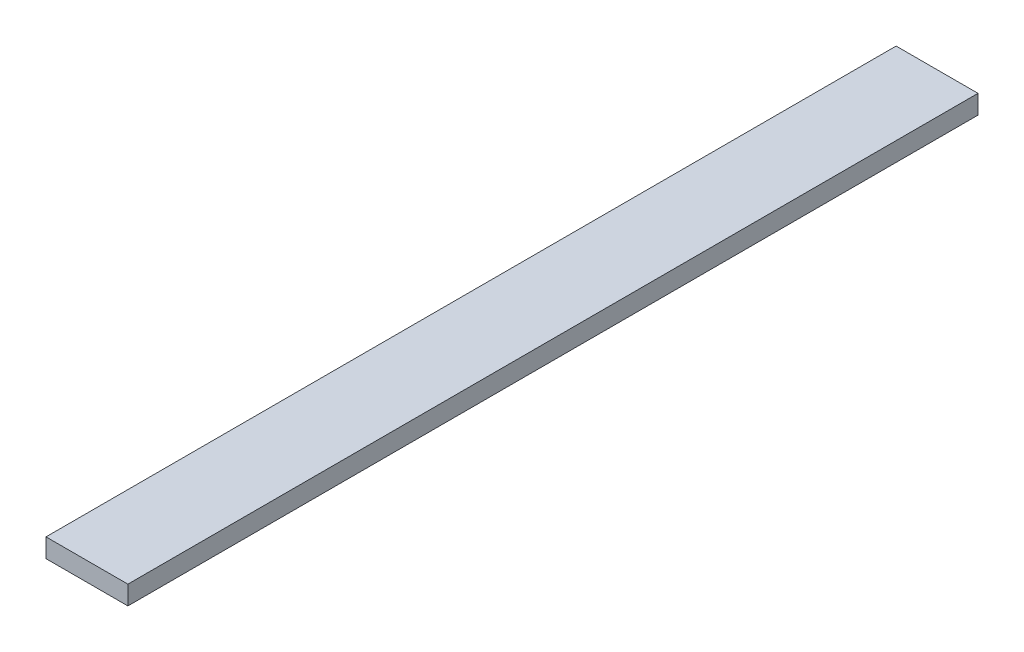
ISO-10303-21;
HEADER;
FILE_DESCRIPTION(('STEP AP214'),'2;1');
FILE_NAME('part.step','',(''),(''),'','','');
FILE_SCHEMA(('AUTOMOTIVE_DESIGN { 1 0 10303 214 1 1 1 1 }'));
ENDSEC;
DATA;
#1=APPLICATION_CONTEXT('core data for automotive mechanical design processes');
#2=APPLICATION_PROTOCOL_DEFINITION('international standard','automotive_design',2000,#1);
#3=PRODUCT_CONTEXT('',#1,'mechanical');
#4=PRODUCT('Part','Part','',(#3));
#5=PRODUCT_RELATED_PRODUCT_CATEGORY('part','',(#4));
#6=PRODUCT_DEFINITION_FORMATION('','',#4);
#7=PRODUCT_DEFINITION_CONTEXT('part definition',#1,'design');
#8=PRODUCT_DEFINITION('design','',#6,#7);
#9=PRODUCT_DEFINITION_SHAPE('','',#8);
#10=(LENGTH_UNIT() NAMED_UNIT(*) SI_UNIT(.MILLI.,.METRE.));
#11=(NAMED_UNIT(*) PLANE_ANGLE_UNIT() SI_UNIT($,.RADIAN.));
#12=(NAMED_UNIT(*) SI_UNIT($,.STERADIAN.) SOLID_ANGLE_UNIT());
#13=UNCERTAINTY_MEASURE_WITH_UNIT(LENGTH_MEASURE(1.E-05),#10,'distance_accuracy_value','');
#14=(GEOMETRIC_REPRESENTATION_CONTEXT(3) GLOBAL_UNCERTAINTY_ASSIGNED_CONTEXT((#13)) GLOBAL_UNIT_ASSIGNED_CONTEXT((#10,
#11,#12)) REPRESENTATION_CONTEXT('',''));
#15=CARTESIAN_POINT('',(0.,0.,0.));
#16=DIRECTION('',(0.,0.,1.));
#17=DIRECTION('',(1.,0.,0.));
#18=AXIS2_PLACEMENT_3D('',#15,#16,#17);
#19=CARTESIAN_POINT('',(0.,0.,428.498));
#20=DIRECTION('',(1.,0.,0.));
#21=DIRECTION('',(0.,0.,-1.));
#22=AXIS2_PLACEMENT_3D('',#19,#20,#21);
#23=PLANE('',#22);
#24=DIRECTION('',(0.,-1.,0.));
#25=VECTOR('',#24,1.);
#26=CARTESIAN_POINT('',(0.,0.,0.));
#27=LINE('',#26,#25);
#28=CARTESIAN_POINT('',(0.,9.525,0.));
#29=VERTEX_POINT('',#28);
#30=CARTESIAN_POINT('',(0.,0.,0.));
#31=VERTEX_POINT('',#30);
#32=EDGE_CURVE('E98',#29,#31,#27,.T.);
#33=ORIENTED_EDGE('',*,*,#32,.T.);
#34=DIRECTION('',(0.,0.,-1.));
#35=VECTOR('',#34,1.);
#36=CARTESIAN_POINT('',(0.,0.,428.498));
#37=LINE('',#36,#35);
#38=CARTESIAN_POINT('',(0.,0.,428.498));
#39=VERTEX_POINT('',#38);
#40=EDGE_CURVE('E11',#39,#31,#37,.T.);
#41=ORIENTED_EDGE('',*,*,#40,.F.);
#42=DIRECTION('',(0.,-1.,0.));
#43=VECTOR('',#42,1.);
#44=CARTESIAN_POINT('',(0.,0.,428.498));
#45=LINE('',#44,#43);
#46=CARTESIAN_POINT('',(0.,9.525,428.498));
#47=VERTEX_POINT('',#46);
#48=EDGE_CURVE('E86',#47,#39,#45,.T.);
#49=ORIENTED_EDGE('',*,*,#48,.F.);
#50=DIRECTION('',(0.,0.,-1.));
#51=VECTOR('',#50,1.);
#52=CARTESIAN_POINT('',(0.,9.525,428.498));
#53=LINE('',#52,#51);
#54=EDGE_CURVE('E94',#47,#29,#53,.T.);
#55=ORIENTED_EDGE('',*,*,#54,.T.);
#56=EDGE_LOOP('',(#33,#41,#49,#55));
#57=FACE_BOUND('',#56,.T.);
#58=ADVANCED_FACE('F35',(#57),#23,.F.);
#59=CARTESIAN_POINT('',(0.,0.,428.498));
#60=DIRECTION('',(0.,1.,0.));
#61=DIRECTION('',(0.,0.,1.));
#62=AXIS2_PLACEMENT_3D('',#59,#60,#61);
#63=PLANE('',#62);
#64=DIRECTION('',(1.,0.,0.));
#65=VECTOR('',#64,1.);
#66=CARTESIAN_POINT('',(0.,0.,0.));
#67=LINE('',#66,#65);
#68=CARTESIAN_POINT('',(41.275,0.,0.));
#69=VERTEX_POINT('',#68);
#70=EDGE_CURVE('E90',#31,#69,#67,.T.);
#71=ORIENTED_EDGE('',*,*,#70,.T.);
#72=DIRECTION('',(0.,0.,-1.));
#73=VECTOR('',#72,1.);
#74=CARTESIAN_POINT('',(41.275,0.,428.498));
#75=LINE('',#74,#73);
#76=CARTESIAN_POINT('',(41.275,0.,428.498));
#77=VERTEX_POINT('',#76);
#78=EDGE_CURVE('E43',#77,#69,#75,.T.);
#79=ORIENTED_EDGE('',*,*,#78,.F.);
#80=DIRECTION('',(1.,0.,0.));
#81=VECTOR('',#80,1.);
#82=CARTESIAN_POINT('',(0.,0.,428.498));
#83=LINE('',#82,#81);
#84=EDGE_CURVE('E81',#39,#77,#83,.T.);
#85=ORIENTED_EDGE('',*,*,#84,.F.);
#86=ORIENTED_EDGE('',*,*,#40,.T.);
#87=EDGE_LOOP('',(#71,#79,#85,#86));
#88=FACE_BOUND('',#87,.T.);
#89=ADVANCED_FACE('F89',(#88),#63,.F.);
#90=CARTESIAN_POINT('',(41.275,0.,428.498));
#91=DIRECTION('',(-1.,0.,0.));
#92=DIRECTION('',(0.,0.,1.));
#93=AXIS2_PLACEMENT_3D('',#90,#91,#92);
#94=PLANE('',#93);
#95=DIRECTION('',(0.,1.,0.));
#96=VECTOR('',#95,1.);
#97=CARTESIAN_POINT('',(41.275,0.,0.));
#98=LINE('',#97,#96);
#99=CARTESIAN_POINT('',(41.275,9.525,0.));
#100=VERTEX_POINT('',#99);
#101=EDGE_CURVE('E68',#69,#100,#98,.T.);
#102=ORIENTED_EDGE('',*,*,#101,.T.);
#103=DIRECTION('',(0.,0.,-1.));
#104=VECTOR('',#103,1.);
#105=CARTESIAN_POINT('',(41.275,9.525,428.498));
#106=LINE('',#105,#104);
#107=CARTESIAN_POINT('',(41.275,9.525,428.498));
#108=VERTEX_POINT('',#107);
#109=EDGE_CURVE('E91',#108,#100,#106,.T.);
#110=ORIENTED_EDGE('',*,*,#109,.F.);
#111=DIRECTION('',(0.,1.,0.));
#112=VECTOR('',#111,1.);
#113=CARTESIAN_POINT('',(41.275,0.,428.498));
#114=LINE('',#113,#112);
#115=EDGE_CURVE('E84',#77,#108,#114,.T.);
#116=ORIENTED_EDGE('',*,*,#115,.F.);
#117=ORIENTED_EDGE('',*,*,#78,.T.);
#118=EDGE_LOOP('',(#102,#110,#116,#117));
#119=FACE_BOUND('',#118,.T.);
#120=ADVANCED_FACE('F92',(#119),#94,.F.);
#121=CARTESIAN_POINT('',(0.,9.525,428.498));
#122=DIRECTION('',(0.,-1.,0.));
#123=DIRECTION('',(0.,0.,-1.));
#124=AXIS2_PLACEMENT_3D('',#121,#122,#123);
#125=PLANE('',#124);
#126=DIRECTION('',(-1.,0.,0.));
#127=VECTOR('',#126,1.);
#128=CARTESIAN_POINT('',(0.,9.525,0.));
#129=LINE('',#128,#127);
#130=EDGE_CURVE('E74',#100,#29,#129,.T.);
#131=ORIENTED_EDGE('',*,*,#130,.T.);
#132=ORIENTED_EDGE('',*,*,#54,.F.);
#133=DIRECTION('',(-1.,0.,0.));
#134=VECTOR('',#133,1.);
#135=CARTESIAN_POINT('',(0.,9.525,428.498));
#136=LINE('',#135,#134);
#137=EDGE_CURVE('E51',#108,#47,#136,.T.);
#138=ORIENTED_EDGE('',*,*,#137,.F.);
#139=ORIENTED_EDGE('',*,*,#109,.T.);
#140=EDGE_LOOP('',(#131,#132,#138,#139));
#141=FACE_BOUND('',#140,.T.);
#142=ADVANCED_FACE('F105',(#141),#125,.F.);
#143=CARTESIAN_POINT('',(0.,0.,428.498));
#144=DIRECTION('',(0.,0.,-1.));
#145=DIRECTION('',(-1.,0.,0.));
#146=AXIS2_PLACEMENT_3D('',#143,#144,#145);
#147=PLANE('',#146);
#148=ORIENTED_EDGE('',*,*,#48,.T.);
#149=ORIENTED_EDGE('',*,*,#84,.T.);
#150=ORIENTED_EDGE('',*,*,#115,.T.);
#151=ORIENTED_EDGE('',*,*,#137,.T.);
#152=EDGE_LOOP('',(#148,#149,#150,#151));
#153=FACE_BOUND('',#152,.T.);
#154=ADVANCED_FACE('F82',(#153),#147,.F.);
#155=CARTESIAN_POINT('',(0.,0.,0.));
#156=DIRECTION('',(0.,0.,-1.));
#157=DIRECTION('',(-1.,0.,0.));
#158=AXIS2_PLACEMENT_3D('',#155,#156,#157);
#159=PLANE('',#158);
#160=ORIENTED_EDGE('',*,*,#32,.F.);
#161=ORIENTED_EDGE('',*,*,#130,.F.);
#162=ORIENTED_EDGE('',*,*,#101,.F.);
#163=ORIENTED_EDGE('',*,*,#70,.F.);
#164=EDGE_LOOP('',(#160,#161,#162,#163));
#165=FACE_BOUND('',#164,.T.);
#166=ADVANCED_FACE('F108',(#165),#159,.T.);
#167=CLOSED_SHELL('',(#58,#89,#120,#142,#154,#166));
#168=MANIFOLD_SOLID_BREP('B2',#167);
#169=ADVANCED_BREP_SHAPE_REPRESENTATION('',(#18,#168),#14);
#170=SHAPE_DEFINITION_REPRESENTATION(#9,#169);
ENDSEC;
END-ISO-10303-21;
